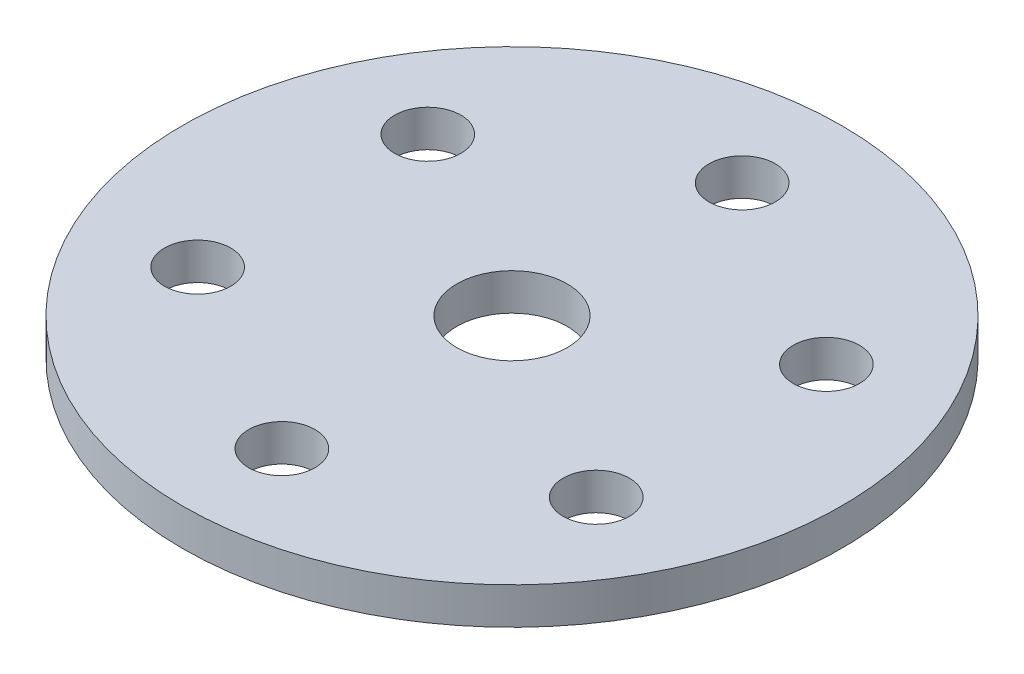
ISO-10303-21;
HEADER;
FILE_DESCRIPTION(('STEP AP214'),'2;1');
FILE_NAME('part.step','',(''),(''),'','','');
FILE_SCHEMA(('AUTOMOTIVE_DESIGN { 1 0 10303 214 1 1 1 1 }'));
ENDSEC;
DATA;
#1=APPLICATION_CONTEXT('core data for automotive mechanical design processes');
#2=APPLICATION_PROTOCOL_DEFINITION('international standard','automotive_design',2000,#1);
#3=PRODUCT_CONTEXT('',#1,'mechanical');
#4=PRODUCT('Part','Part','',(#3));
#5=PRODUCT_RELATED_PRODUCT_CATEGORY('part','',(#4));
#6=PRODUCT_DEFINITION_FORMATION('','',#4);
#7=PRODUCT_DEFINITION_CONTEXT('part definition',#1,'design');
#8=PRODUCT_DEFINITION('design','',#6,#7);
#9=PRODUCT_DEFINITION_SHAPE('','',#8);
#10=(LENGTH_UNIT() NAMED_UNIT(*) SI_UNIT(.MILLI.,.METRE.));
#11=(NAMED_UNIT(*) PLANE_ANGLE_UNIT() SI_UNIT($,.RADIAN.));
#12=(NAMED_UNIT(*) SI_UNIT($,.STERADIAN.) SOLID_ANGLE_UNIT());
#13=UNCERTAINTY_MEASURE_WITH_UNIT(LENGTH_MEASURE(1.E-05),#10,'distance_accuracy_value','');
#14=(GEOMETRIC_REPRESENTATION_CONTEXT(3) GLOBAL_UNCERTAINTY_ASSIGNED_CONTEXT((#13)) GLOBAL_UNIT_ASSIGNED_CONTEXT((#10,
#11,#12)) REPRESENTATION_CONTEXT('',''));
#15=CARTESIAN_POINT('',(0.,0.,0.));
#16=DIRECTION('',(0.,0.,1.));
#17=DIRECTION('',(1.,0.,0.));
#18=AXIS2_PLACEMENT_3D('',#15,#16,#17);
#19=CARTESIAN_POINT('',(0.,2.,0.));
#20=DIRECTION('',(0.,1.,0.));
#21=DIRECTION('',(0.,0.,1.));
#22=AXIS2_PLACEMENT_3D('',#19,#20,#21);
#23=PLANE('',#22);
#24=CARTESIAN_POINT('',(0.,2.,-12.5));
#25=DIRECTION('',(0.,1.,0.));
#26=DIRECTION('',(0.,0.,1.));
#27=AXIS2_PLACEMENT_3D('',#24,#25,#26);
#28=CIRCLE('',#27,1.8);
#29=CARTESIAN_POINT('',(0.,2.,-10.7));
#30=VERTEX_POINT('',#29);
#31=EDGE_CURVE('E82',#30,#30,#28,.T.);
#32=ORIENTED_EDGE('',*,*,#31,.F.);
#33=EDGE_LOOP('',(#32));
#34=FACE_BOUND('',#33,.T.);
#35=CARTESIAN_POINT('',(-10.8253175473055,2.,-6.25));
#36=DIRECTION('',(0.,1.,0.));
#37=DIRECTION('',(0.,0.,1.));
#38=AXIS2_PLACEMENT_3D('',#35,#36,#37);
#39=CIRCLE('',#38,1.8);
#40=CARTESIAN_POINT('',(-10.8253175473055,2.,-4.45));
#41=VERTEX_POINT('',#40);
#42=EDGE_CURVE('E76',#41,#41,#39,.T.);
#43=ORIENTED_EDGE('',*,*,#42,.F.);
#44=EDGE_LOOP('',(#43));
#45=FACE_BOUND('',#44,.T.);
#46=CARTESIAN_POINT('',(-10.8253175473055,2.,6.25));
#47=DIRECTION('',(0.,1.,0.));
#48=DIRECTION('',(0.,0.,1.));
#49=AXIS2_PLACEMENT_3D('',#46,#47,#48);
#50=CIRCLE('',#49,1.8);
#51=CARTESIAN_POINT('',(-10.8253175473055,2.,8.05));
#52=VERTEX_POINT('',#51);
#53=EDGE_CURVE('E70',#52,#52,#50,.T.);
#54=ORIENTED_EDGE('',*,*,#53,.F.);
#55=EDGE_LOOP('',(#54));
#56=FACE_BOUND('',#55,.T.);
#57=CARTESIAN_POINT('',(0.,2.,12.5));
#58=DIRECTION('',(0.,1.,0.));
#59=DIRECTION('',(0.,0.,1.));
#60=AXIS2_PLACEMENT_3D('',#57,#58,#59);
#61=CIRCLE('',#60,1.8);
#62=CARTESIAN_POINT('',(0.,2.,14.3));
#63=VERTEX_POINT('',#62);
#64=EDGE_CURVE('E64',#63,#63,#61,.T.);
#65=ORIENTED_EDGE('',*,*,#64,.F.);
#66=EDGE_LOOP('',(#65));
#67=FACE_BOUND('',#66,.T.);
#68=CARTESIAN_POINT('',(10.8253175473055,2.,6.25));
#69=DIRECTION('',(0.,1.,0.));
#70=DIRECTION('',(0.,0.,1.));
#71=AXIS2_PLACEMENT_3D('',#68,#69,#70);
#72=CIRCLE('',#71,1.8);
#73=CARTESIAN_POINT('',(10.8253175473055,2.,8.05));
#74=VERTEX_POINT('',#73);
#75=EDGE_CURVE('E58',#74,#74,#72,.T.);
#76=ORIENTED_EDGE('',*,*,#75,.F.);
#77=EDGE_LOOP('',(#76));
#78=FACE_BOUND('',#77,.T.);
#79=CARTESIAN_POINT('',(10.8253175473055,2.,-6.25));
#80=DIRECTION('',(0.,1.,0.));
#81=DIRECTION('',(0.,0.,1.));
#82=AXIS2_PLACEMENT_3D('',#79,#80,#81);
#83=CIRCLE('',#82,1.8);
#84=CARTESIAN_POINT('',(10.8253175473055,2.,-4.45));
#85=VERTEX_POINT('',#84);
#86=EDGE_CURVE('E52',#85,#85,#83,.T.);
#87=ORIENTED_EDGE('',*,*,#86,.F.);
#88=EDGE_LOOP('',(#87));
#89=FACE_BOUND('',#88,.T.);
#90=CARTESIAN_POINT('',(0.,2.,0.));
#91=DIRECTION('',(0.,1.,0.));
#92=DIRECTION('',(0.,0.,1.));
#93=AXIS2_PLACEMENT_3D('',#90,#91,#92);
#94=CIRCLE('',#93,17.9);
#95=CARTESIAN_POINT('',(0.,2.,17.9));
#96=VERTEX_POINT('',#95);
#97=EDGE_CURVE('E10',#96,#96,#94,.T.);
#98=ORIENTED_EDGE('',*,*,#97,.T.);
#99=EDGE_LOOP('',(#98));
#100=FACE_BOUND('',#99,.T.);
#101=CARTESIAN_POINT('',(0.,2.,0.));
#102=DIRECTION('',(0.,1.,0.));
#103=DIRECTION('',(0.,0.,1.));
#104=AXIS2_PLACEMENT_3D('',#101,#102,#103);
#105=CIRCLE('',#104,3.);
#106=CARTESIAN_POINT('',(0.,2.,3.));
#107=VERTEX_POINT('',#106);
#108=EDGE_CURVE('E42',#107,#107,#105,.T.);
#109=ORIENTED_EDGE('',*,*,#108,.F.);
#110=EDGE_LOOP('',(#109));
#111=FACE_BOUND('',#110,.T.);
#112=ADVANCED_FACE('F31',(#34,#45,#56,#67,#78,#89,#100,#111),#23,.T.);
#113=CARTESIAN_POINT('',(0.,0.,0.));
#114=DIRECTION('',(0.,1.,0.));
#115=DIRECTION('',(0.,0.,1.));
#116=AXIS2_PLACEMENT_3D('',#113,#114,#115);
#117=PLANE('',#116);
#118=CARTESIAN_POINT('',(0.,0.,-12.5));
#119=DIRECTION('',(0.,1.,0.));
#120=DIRECTION('',(0.,0.,1.));
#121=AXIS2_PLACEMENT_3D('',#118,#119,#120);
#122=CIRCLE('',#121,1.8);
#123=CARTESIAN_POINT('',(0.,0.,-10.7));
#124=VERTEX_POINT('',#123);
#125=EDGE_CURVE('E79',#124,#124,#122,.T.);
#126=ORIENTED_EDGE('',*,*,#125,.T.);
#127=EDGE_LOOP('',(#126));
#128=FACE_BOUND('',#127,.T.);
#129=CARTESIAN_POINT('',(-10.8253175473055,0.,-6.25));
#130=DIRECTION('',(0.,1.,0.));
#131=DIRECTION('',(0.,0.,1.));
#132=AXIS2_PLACEMENT_3D('',#129,#130,#131);
#133=CIRCLE('',#132,1.8);
#134=CARTESIAN_POINT('',(-10.8253175473055,0.,-4.45));
#135=VERTEX_POINT('',#134);
#136=EDGE_CURVE('E73',#135,#135,#133,.T.);
#137=ORIENTED_EDGE('',*,*,#136,.T.);
#138=EDGE_LOOP('',(#137));
#139=FACE_BOUND('',#138,.T.);
#140=CARTESIAN_POINT('',(-10.8253175473055,0.,6.25));
#141=DIRECTION('',(0.,1.,0.));
#142=DIRECTION('',(0.,0.,1.));
#143=AXIS2_PLACEMENT_3D('',#140,#141,#142);
#144=CIRCLE('',#143,1.8);
#145=CARTESIAN_POINT('',(-10.8253175473055,0.,8.05));
#146=VERTEX_POINT('',#145);
#147=EDGE_CURVE('E67',#146,#146,#144,.T.);
#148=ORIENTED_EDGE('',*,*,#147,.T.);
#149=EDGE_LOOP('',(#148));
#150=FACE_BOUND('',#149,.T.);
#151=CARTESIAN_POINT('',(0.,0.,12.5));
#152=DIRECTION('',(0.,1.,0.));
#153=DIRECTION('',(0.,0.,1.));
#154=AXIS2_PLACEMENT_3D('',#151,#152,#153);
#155=CIRCLE('',#154,1.8);
#156=CARTESIAN_POINT('',(0.,0.,14.3));
#157=VERTEX_POINT('',#156);
#158=EDGE_CURVE('E61',#157,#157,#155,.T.);
#159=ORIENTED_EDGE('',*,*,#158,.T.);
#160=EDGE_LOOP('',(#159));
#161=FACE_BOUND('',#160,.T.);
#162=CARTESIAN_POINT('',(10.8253175473055,0.,6.25));
#163=DIRECTION('',(0.,1.,0.));
#164=DIRECTION('',(0.,0.,1.));
#165=AXIS2_PLACEMENT_3D('',#162,#163,#164);
#166=CIRCLE('',#165,1.8);
#167=CARTESIAN_POINT('',(10.8253175473055,0.,8.05));
#168=VERTEX_POINT('',#167);
#169=EDGE_CURVE('E55',#168,#168,#166,.T.);
#170=ORIENTED_EDGE('',*,*,#169,.T.);
#171=EDGE_LOOP('',(#170));
#172=FACE_BOUND('',#171,.T.);
#173=CARTESIAN_POINT('',(10.8253175473055,0.,-6.25));
#174=DIRECTION('',(0.,1.,0.));
#175=DIRECTION('',(0.,0.,1.));
#176=AXIS2_PLACEMENT_3D('',#173,#174,#175);
#177=CIRCLE('',#176,1.8);
#178=CARTESIAN_POINT('',(10.8253175473055,0.,-4.45));
#179=VERTEX_POINT('',#178);
#180=EDGE_CURVE('E47',#179,#179,#177,.T.);
#181=ORIENTED_EDGE('',*,*,#180,.T.);
#182=EDGE_LOOP('',(#181));
#183=FACE_BOUND('',#182,.T.);
#184=CARTESIAN_POINT('',(0.,0.,0.));
#185=DIRECTION('',(0.,1.,0.));
#186=DIRECTION('',(0.,0.,1.));
#187=AXIS2_PLACEMENT_3D('',#184,#185,#186);
#188=CIRCLE('',#187,17.9);
#189=CARTESIAN_POINT('',(0.,0.,17.9));
#190=VERTEX_POINT('',#189);
#191=EDGE_CURVE('E35',#190,#190,#188,.T.);
#192=ORIENTED_EDGE('',*,*,#191,.F.);
#193=EDGE_LOOP('',(#192));
#194=FACE_BOUND('',#193,.T.);
#195=CARTESIAN_POINT('',(0.,0.,0.));
#196=DIRECTION('',(0.,1.,0.));
#197=DIRECTION('',(0.,0.,1.));
#198=AXIS2_PLACEMENT_3D('',#195,#196,#197);
#199=CIRCLE('',#198,3.);
#200=CARTESIAN_POINT('',(0.,0.,3.));
#201=VERTEX_POINT('',#200);
#202=EDGE_CURVE('E44',#201,#201,#199,.T.);
#203=ORIENTED_EDGE('',*,*,#202,.T.);
#204=EDGE_LOOP('',(#203));
#205=FACE_BOUND('',#204,.T.);
#206=ADVANCED_FACE('F90',(#128,#139,#150,#161,#172,#183,#194,#205),#117,.F.);
#207=CARTESIAN_POINT('',(0.,2.,0.));
#208=DIRECTION('',(0.,-1.,0.));
#209=DIRECTION('',(0.,0.,-1.));
#210=AXIS2_PLACEMENT_3D('',#207,#208,#209);
#211=CYLINDRICAL_SURFACE('',#210,17.9);
#212=ORIENTED_EDGE('',*,*,#97,.F.);
#213=EDGE_LOOP('',(#212));
#214=FACE_BOUND('',#213,.T.);
#215=ORIENTED_EDGE('',*,*,#191,.T.);
#216=EDGE_LOOP('',(#215));
#217=FACE_BOUND('',#216,.T.);
#218=ADVANCED_FACE('F33',(#214,#217),#211,.T.);
#219=CARTESIAN_POINT('',(0.,2.,0.));
#220=DIRECTION('',(0.,-1.,0.));
#221=DIRECTION('',(0.,0.,-1.));
#222=AXIS2_PLACEMENT_3D('',#219,#220,#221);
#223=CYLINDRICAL_SURFACE('',#222,3.);
#224=ORIENTED_EDGE('',*,*,#108,.T.);
#225=EDGE_LOOP('',(#224));
#226=FACE_BOUND('',#225,.T.);
#227=ORIENTED_EDGE('',*,*,#202,.F.);
#228=EDGE_LOOP('',(#227));
#229=FACE_BOUND('',#228,.T.);
#230=ADVANCED_FACE('F104',(#226,#229),#223,.F.);
#231=CARTESIAN_POINT('',(10.8253175473055,2.,-6.25));
#232=DIRECTION('',(0.,1.,0.));
#233=DIRECTION('',(0.,0.,1.));
#234=AXIS2_PLACEMENT_3D('',#231,#232,#233);
#235=CYLINDRICAL_SURFACE('',#234,1.8);
#236=ORIENTED_EDGE('',*,*,#180,.F.);
#237=EDGE_LOOP('',(#236));
#238=FACE_BOUND('',#237,.T.);
#239=ORIENTED_EDGE('',*,*,#86,.T.);
#240=EDGE_LOOP('',(#239));
#241=FACE_BOUND('',#240,.T.);
#242=ADVANCED_FACE('F107',(#238,#241),#235,.F.);
#243=CARTESIAN_POINT('',(10.8253175473055,2.,6.25));
#244=DIRECTION('',(0.,1.,0.));
#245=DIRECTION('',(0.,0.,1.));
#246=AXIS2_PLACEMENT_3D('',#243,#244,#245);
#247=CYLINDRICAL_SURFACE('',#246,1.8);
#248=ORIENTED_EDGE('',*,*,#169,.F.);
#249=EDGE_LOOP('',(#248));
#250=FACE_BOUND('',#249,.T.);
#251=ORIENTED_EDGE('',*,*,#75,.T.);
#252=EDGE_LOOP('',(#251));
#253=FACE_BOUND('',#252,.T.);
#254=ADVANCED_FACE('F121',(#250,#253),#247,.F.);
#255=CARTESIAN_POINT('',(0.,2.,12.5));
#256=DIRECTION('',(0.,1.,0.));
#257=DIRECTION('',(0.,0.,1.));
#258=AXIS2_PLACEMENT_3D('',#255,#256,#257);
#259=CYLINDRICAL_SURFACE('',#258,1.8);
#260=ORIENTED_EDGE('',*,*,#158,.F.);
#261=EDGE_LOOP('',(#260));
#262=FACE_BOUND('',#261,.T.);
#263=ORIENTED_EDGE('',*,*,#64,.T.);
#264=EDGE_LOOP('',(#263));
#265=FACE_BOUND('',#264,.T.);
#266=ADVANCED_FACE('F125',(#262,#265),#259,.F.);
#267=CARTESIAN_POINT('',(-10.8253175473055,2.,6.25));
#268=DIRECTION('',(0.,1.,0.));
#269=DIRECTION('',(0.,0.,1.));
#270=AXIS2_PLACEMENT_3D('',#267,#268,#269);
#271=CYLINDRICAL_SURFACE('',#270,1.8);
#272=ORIENTED_EDGE('',*,*,#147,.F.);
#273=EDGE_LOOP('',(#272));
#274=FACE_BOUND('',#273,.T.);
#275=ORIENTED_EDGE('',*,*,#53,.T.);
#276=EDGE_LOOP('',(#275));
#277=FACE_BOUND('',#276,.T.);
#278=ADVANCED_FACE('F129',(#274,#277),#271,.F.);
#279=CARTESIAN_POINT('',(-10.8253175473055,2.,-6.25));
#280=DIRECTION('',(0.,1.,0.));
#281=DIRECTION('',(0.,0.,1.));
#282=AXIS2_PLACEMENT_3D('',#279,#280,#281);
#283=CYLINDRICAL_SURFACE('',#282,1.8);
#284=ORIENTED_EDGE('',*,*,#136,.F.);
#285=EDGE_LOOP('',(#284));
#286=FACE_BOUND('',#285,.T.);
#287=ORIENTED_EDGE('',*,*,#42,.T.);
#288=EDGE_LOOP('',(#287));
#289=FACE_BOUND('',#288,.T.);
#290=ADVANCED_FACE('F133',(#286,#289),#283,.F.);
#291=CARTESIAN_POINT('',(0.,2.,-12.5));
#292=DIRECTION('',(0.,1.,0.));
#293=DIRECTION('',(0.,0.,1.));
#294=AXIS2_PLACEMENT_3D('',#291,#292,#293);
#295=CYLINDRICAL_SURFACE('',#294,1.8);
#296=ORIENTED_EDGE('',*,*,#125,.F.);
#297=EDGE_LOOP('',(#296));
#298=FACE_BOUND('',#297,.T.);
#299=ORIENTED_EDGE('',*,*,#31,.T.);
#300=EDGE_LOOP('',(#299));
#301=FACE_BOUND('',#300,.T.);
#302=ADVANCED_FACE('F86',(#298,#301),#295,.F.);
#303=CLOSED_SHELL('',(#112,#206,#218,#230,#242,#254,#266,#278,#290,#302));
#304=MANIFOLD_SOLID_BREP('B2',#303);
#305=ADVANCED_BREP_SHAPE_REPRESENTATION('',(#18,#304),#14);
#306=SHAPE_DEFINITION_REPRESENTATION(#9,#305);
ENDSEC;
END-ISO-10303-21;
